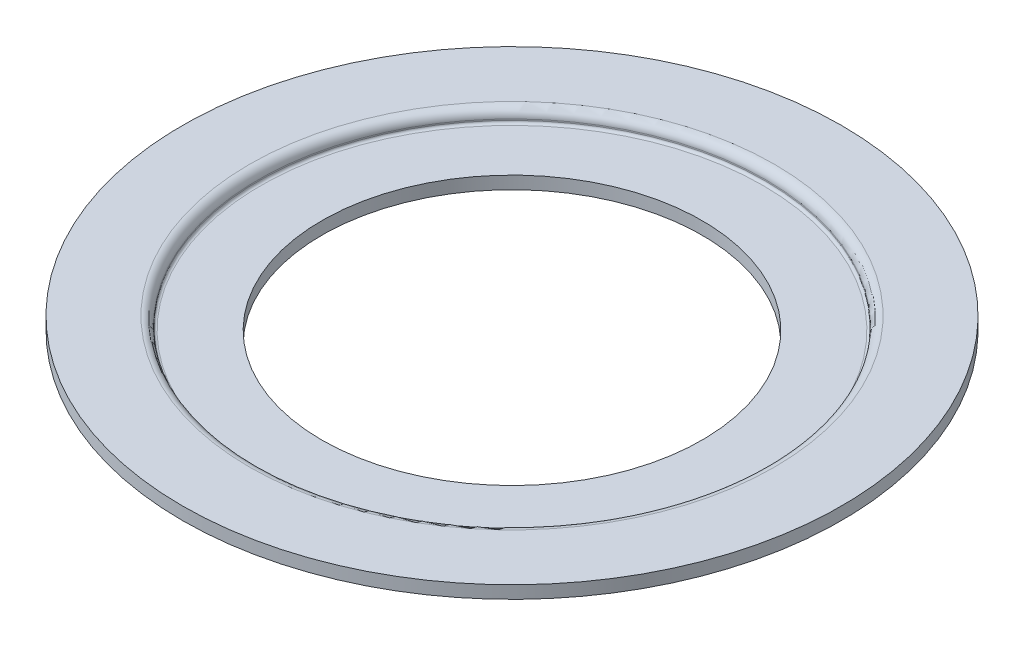
ISO-10303-21;
HEADER;
FILE_DESCRIPTION(('STEP AP214'),'2;1');
FILE_NAME('part.step','',(''),(''),'','','');
FILE_SCHEMA(('AUTOMOTIVE_DESIGN { 1 0 10303 214 1 1 1 1 }'));
ENDSEC;
DATA;
#1=APPLICATION_CONTEXT('core data for automotive mechanical design processes');
#2=APPLICATION_PROTOCOL_DEFINITION('international standard','automotive_design',2000,#1);
#3=PRODUCT_CONTEXT('',#1,'mechanical');
#4=PRODUCT('Part','Part','',(#3));
#5=PRODUCT_RELATED_PRODUCT_CATEGORY('part','',(#4));
#6=PRODUCT_DEFINITION_FORMATION('','',#4);
#7=PRODUCT_DEFINITION_CONTEXT('part definition',#1,'design');
#8=PRODUCT_DEFINITION('design','',#6,#7);
#9=PRODUCT_DEFINITION_SHAPE('','',#8);
#10=(LENGTH_UNIT() NAMED_UNIT(*) SI_UNIT(.MILLI.,.METRE.));
#11=(NAMED_UNIT(*) PLANE_ANGLE_UNIT() SI_UNIT($,.RADIAN.));
#12=(NAMED_UNIT(*) SI_UNIT($,.STERADIAN.) SOLID_ANGLE_UNIT());
#13=UNCERTAINTY_MEASURE_WITH_UNIT(LENGTH_MEASURE(1.E-05),#10,'distance_accuracy_value','');
#14=(GEOMETRIC_REPRESENTATION_CONTEXT(3) GLOBAL_UNCERTAINTY_ASSIGNED_CONTEXT((#13)) GLOBAL_UNIT_ASSIGNED_CONTEXT((#10,
#11,#12)) REPRESENTATION_CONTEXT('',''));
#15=CARTESIAN_POINT('',(0.,0.,0.));
#16=DIRECTION('',(0.,0.,1.));
#17=DIRECTION('',(1.,0.,0.));
#18=AXIS2_PLACEMENT_3D('',#15,#16,#17);
#19=CARTESIAN_POINT('',(-20.,-1.,0.));
#20=DIRECTION('',(0.,-1.,0.));
#21=DIRECTION('',(0.,0.,-1.));
#22=AXIS2_PLACEMENT_3D('',#19,#20,#21);
#23=PLANE('',#22);
#24=CARTESIAN_POINT('',(0.,-1.,0.));
#25=DIRECTION('',(0.,-1.,0.));
#26=DIRECTION('',(0.,0.,-1.));
#27=AXIS2_PLACEMENT_3D('',#24,#25,#26);
#28=CIRCLE('',#27,20.3);
#29=CARTESIAN_POINT('',(0.,-1.,-20.3));
#30=VERTEX_POINT('',#29);
#31=EDGE_CURVE('E41',#30,#30,#28,.T.);
#32=ORIENTED_EDGE('',*,*,#31,.T.);
#33=EDGE_LOOP('',(#32));
#34=FACE_BOUND('',#33,.T.);
#35=CARTESIAN_POINT('',(0.,-1.,0.));
#36=DIRECTION('',(0.,1.,0.));
#37=DIRECTION('',(0.,0.,1.));
#38=AXIS2_PLACEMENT_3D('',#35,#36,#37);
#39=CIRCLE('',#38,15.);
#40=CARTESIAN_POINT('',(0.,-1.,15.));
#41=VERTEX_POINT('',#40);
#42=EDGE_CURVE('E68',#41,#41,#39,.T.);
#43=ORIENTED_EDGE('',*,*,#42,.T.);
#44=EDGE_LOOP('',(#43));
#45=FACE_BOUND('',#44,.T.);
#46=ADVANCED_FACE('F31',(#34,#45),#23,.T.);
#47=CARTESIAN_POINT('',(0.,0.,0.));
#48=DIRECTION('',(0.,1.,0.));
#49=DIRECTION('',(0.,0.,1.));
#50=AXIS2_PLACEMENT_3D('',#47,#48,#49);
#51=CYLINDRICAL_SURFACE('',#50,21.);
#52=CARTESIAN_POINT('',(0.,-0.3,0.));
#53=DIRECTION('',(0.,-1.,0.));
#54=DIRECTION('',(0.,0.,-1.));
#55=AXIS2_PLACEMENT_3D('',#52,#53,#54);
#56=CIRCLE('',#55,21.);
#57=CARTESIAN_POINT('',(0.,-0.3,-21.));
#58=VERTEX_POINT('',#57);
#59=EDGE_CURVE('E45',#58,#58,#56,.F.);
#60=ORIENTED_EDGE('',*,*,#59,.T.);
#61=EDGE_LOOP('',(#60));
#62=FACE_BOUND('',#61,.T.);
#63=CARTESIAN_POINT('',(0.,0.,0.));
#64=DIRECTION('',(0.,1.,0.));
#65=DIRECTION('',(0.,0.,1.));
#66=AXIS2_PLACEMENT_3D('',#63,#64,#65);
#67=CIRCLE('',#66,21.);
#68=CARTESIAN_POINT('',(0.,0.,21.));
#69=VERTEX_POINT('',#68);
#70=EDGE_CURVE('E56',#69,#69,#67,.T.);
#71=ORIENTED_EDGE('',*,*,#70,.F.);
#72=EDGE_LOOP('',(#71));
#73=FACE_BOUND('',#72,.T.);
#74=ADVANCED_FACE('F90',(#62,#73),#51,.T.);
#75=CARTESIAN_POINT('',(-26.,0.,0.));
#76=DIRECTION('',(0.,-1.,0.));
#77=DIRECTION('',(0.,0.,-1.));
#78=AXIS2_PLACEMENT_3D('',#75,#76,#77);
#79=PLANE('',#78);
#80=ORIENTED_EDGE('',*,*,#70,.T.);
#81=EDGE_LOOP('',(#80));
#82=FACE_BOUND('',#81,.T.);
#83=CARTESIAN_POINT('',(0.,0.,0.));
#84=DIRECTION('',(0.,1.,0.));
#85=DIRECTION('',(0.,0.,1.));
#86=AXIS2_PLACEMENT_3D('',#83,#84,#85);
#87=CIRCLE('',#86,26.);
#88=CARTESIAN_POINT('',(0.,0.,26.));
#89=VERTEX_POINT('',#88);
#90=EDGE_CURVE('E59',#89,#89,#87,.T.);
#91=ORIENTED_EDGE('',*,*,#90,.F.);
#92=EDGE_LOOP('',(#91));
#93=FACE_BOUND('',#92,.T.);
#94=ADVANCED_FACE('F95',(#82,#93),#79,.T.);
#95=CARTESIAN_POINT('',(0.,0.,0.));
#96=DIRECTION('',(0.,1.,0.));
#97=DIRECTION('',(0.,0.,1.));
#98=AXIS2_PLACEMENT_3D('',#95,#96,#97);
#99=CYLINDRICAL_SURFACE('',#98,26.);
#100=CARTESIAN_POINT('',(0.,1.,0.));
#101=DIRECTION('',(0.,1.,0.));
#102=DIRECTION('',(0.,0.,1.));
#103=AXIS2_PLACEMENT_3D('',#100,#101,#102);
#104=CIRCLE('',#103,26.);
#105=CARTESIAN_POINT('',(0.,1.,26.));
#106=VERTEX_POINT('',#105);
#107=EDGE_CURVE('E62',#106,#106,#104,.T.);
#108=ORIENTED_EDGE('',*,*,#107,.F.);
#109=EDGE_LOOP('',(#108));
#110=FACE_BOUND('',#109,.T.);
#111=ORIENTED_EDGE('',*,*,#90,.T.);
#112=EDGE_LOOP('',(#111));
#113=FACE_BOUND('',#112,.T.);
#114=ADVANCED_FACE('F110',(#110,#113),#99,.T.);
#115=CARTESIAN_POINT('',(-26.,1.,0.));
#116=DIRECTION('',(0.,-1.,0.));
#117=DIRECTION('',(0.,0.,-1.));
#118=AXIS2_PLACEMENT_3D('',#115,#116,#117);
#119=PLANE('',#118);
#120=CARTESIAN_POINT('',(0.,1.,0.));
#121=DIRECTION('',(0.,-1.,0.));
#122=DIRECTION('',(0.,0.,-1.));
#123=AXIS2_PLACEMENT_3D('',#120,#121,#122);
#124=CIRCLE('',#123,20.7);
#125=CARTESIAN_POINT('',(0.,1.,-20.7));
#126=VERTEX_POINT('',#125);
#127=EDGE_CURVE('E50',#126,#126,#124,.T.);
#128=ORIENTED_EDGE('',*,*,#127,.T.);
#129=EDGE_LOOP('',(#128));
#130=FACE_BOUND('',#129,.T.);
#131=ORIENTED_EDGE('',*,*,#107,.T.);
#132=EDGE_LOOP('',(#131));
#133=FACE_BOUND('',#132,.T.);
#134=ADVANCED_FACE('F87',(#130,#133),#119,.F.);
#135=CARTESIAN_POINT('',(0.,0.,0.));
#136=DIRECTION('',(0.,1.,0.));
#137=DIRECTION('',(0.,0.,1.));
#138=AXIS2_PLACEMENT_3D('',#135,#136,#137);
#139=CYLINDRICAL_SURFACE('',#138,20.);
#140=CARTESIAN_POINT('',(0.,0.2,0.));
#141=DIRECTION('',(0.,-1.,0.));
#142=DIRECTION('',(0.,0.,-1.));
#143=AXIS2_PLACEMENT_3D('',#140,#141,#142);
#144=CIRCLE('',#143,20.);
#145=CARTESIAN_POINT('',(0.,0.2,-20.));
#146=VERTEX_POINT('',#145);
#147=EDGE_CURVE('E10',#146,#146,#144,.T.);
#148=ORIENTED_EDGE('',*,*,#147,.T.);
#149=EDGE_LOOP('',(#148));
#150=FACE_BOUND('',#149,.T.);
#151=CARTESIAN_POINT('',(0.,0.300000000000001,0.));
#152=DIRECTION('',(0.,-1.,0.));
#153=DIRECTION('',(0.,0.,-1.));
#154=AXIS2_PLACEMENT_3D('',#151,#152,#153);
#155=CIRCLE('',#154,20.);
#156=CARTESIAN_POINT('',(0.,0.300000000000001,-20.));
#157=VERTEX_POINT('',#156);
#158=EDGE_CURVE('E53',#157,#157,#155,.F.);
#159=ORIENTED_EDGE('',*,*,#158,.T.);
#160=EDGE_LOOP('',(#159));
#161=FACE_BOUND('',#160,.T.);
#162=ADVANCED_FACE('F82',(#150,#161),#139,.F.);
#163=CARTESIAN_POINT('',(-20.,0.,0.));
#164=DIRECTION('',(0.,-1.,0.));
#165=DIRECTION('',(0.,0.,-1.));
#166=AXIS2_PLACEMENT_3D('',#163,#164,#165);
#167=PLANE('',#166);
#168=CARTESIAN_POINT('',(0.,0.,0.));
#169=DIRECTION('',(0.,-1.,0.));
#170=DIRECTION('',(0.,0.,-1.));
#171=AXIS2_PLACEMENT_3D('',#168,#169,#170);
#172=CIRCLE('',#171,19.8);
#173=CARTESIAN_POINT('',(0.,0.,-19.8));
#174=VERTEX_POINT('',#173);
#175=EDGE_CURVE('E37',#174,#174,#172,.F.);
#176=ORIENTED_EDGE('',*,*,#175,.T.);
#177=EDGE_LOOP('',(#176));
#178=FACE_BOUND('',#177,.T.);
#179=CARTESIAN_POINT('',(0.,0.,0.));
#180=DIRECTION('',(0.,1.,0.));
#181=DIRECTION('',(0.,0.,1.));
#182=AXIS2_PLACEMENT_3D('',#179,#180,#181);
#183=CIRCLE('',#182,15.);
#184=CARTESIAN_POINT('',(0.,0.,15.));
#185=VERTEX_POINT('',#184);
#186=EDGE_CURVE('E65',#185,#185,#183,.T.);
#187=ORIENTED_EDGE('',*,*,#186,.F.);
#188=EDGE_LOOP('',(#187));
#189=FACE_BOUND('',#188,.T.);
#190=ADVANCED_FACE('F77',(#178,#189),#167,.F.);
#191=CARTESIAN_POINT('',(0.,0.,0.));
#192=DIRECTION('',(0.,1.,0.));
#193=DIRECTION('',(0.,0.,1.));
#194=AXIS2_PLACEMENT_3D('',#191,#192,#193);
#195=CYLINDRICAL_SURFACE('',#194,15.);
#196=ORIENTED_EDGE('',*,*,#42,.F.);
#197=EDGE_LOOP('',(#196));
#198=FACE_BOUND('',#197,.T.);
#199=ORIENTED_EDGE('',*,*,#186,.T.);
#200=EDGE_LOOP('',(#199));
#201=FACE_BOUND('',#200,.T.);
#202=ADVANCED_FACE('F73',(#198,#201),#195,.F.);
#203=CARTESIAN_POINT('',(0.,0.300000000000001,0.));
#204=DIRECTION('',(0.,-1.,0.));
#205=DIRECTION('',(0.,0.,-1.));
#206=AXIS2_PLACEMENT_3D('',#203,#204,#205);
#207=TOROIDAL_SURFACE('',#206,20.7,0.7);
#208=ORIENTED_EDGE('',*,*,#127,.F.);
#209=EDGE_LOOP('',(#208));
#210=FACE_BOUND('',#209,.T.);
#211=ORIENTED_EDGE('',*,*,#158,.F.);
#212=EDGE_LOOP('',(#211));
#213=FACE_BOUND('',#212,.T.);
#214=ADVANCED_FACE('F76',(#210,#213),#207,.T.);
#215=CARTESIAN_POINT('',(0.,-0.3,0.));
#216=DIRECTION('',(0.,-1.,0.));
#217=DIRECTION('',(0.,0.,-1.));
#218=AXIS2_PLACEMENT_3D('',#215,#216,#217);
#219=TOROIDAL_SURFACE('',#218,20.3,0.7);
#220=ORIENTED_EDGE('',*,*,#31,.F.);
#221=EDGE_LOOP('',(#220));
#222=FACE_BOUND('',#221,.T.);
#223=ORIENTED_EDGE('',*,*,#59,.F.);
#224=EDGE_LOOP('',(#223));
#225=FACE_BOUND('',#224,.T.);
#226=ADVANCED_FACE('F99',(#222,#225),#219,.T.);
#227=CARTESIAN_POINT('',(0.,0.2,0.));
#228=DIRECTION('',(0.,-1.,0.));
#229=DIRECTION('',(0.,0.,-1.));
#230=AXIS2_PLACEMENT_3D('',#227,#228,#229);
#231=TOROIDAL_SURFACE('',#230,19.8,0.2);
#232=ORIENTED_EDGE('',*,*,#147,.F.);
#233=EDGE_LOOP('',(#232));
#234=FACE_BOUND('',#233,.T.);
#235=ORIENTED_EDGE('',*,*,#175,.F.);
#236=EDGE_LOOP('',(#235));
#237=FACE_BOUND('',#236,.T.);
#238=ADVANCED_FACE('F102',(#234,#237),#231,.F.);
#239=CLOSED_SHELL('',(#46,#74,#94,#114,#134,#162,#190,#202,#214,#226,#238));
#240=MANIFOLD_SOLID_BREP('B2',#239);
#241=ADVANCED_BREP_SHAPE_REPRESENTATION('',(#18,#240),#14);
#242=SHAPE_DEFINITION_REPRESENTATION(#9,#241);
ENDSEC;
END-ISO-10303-21;
